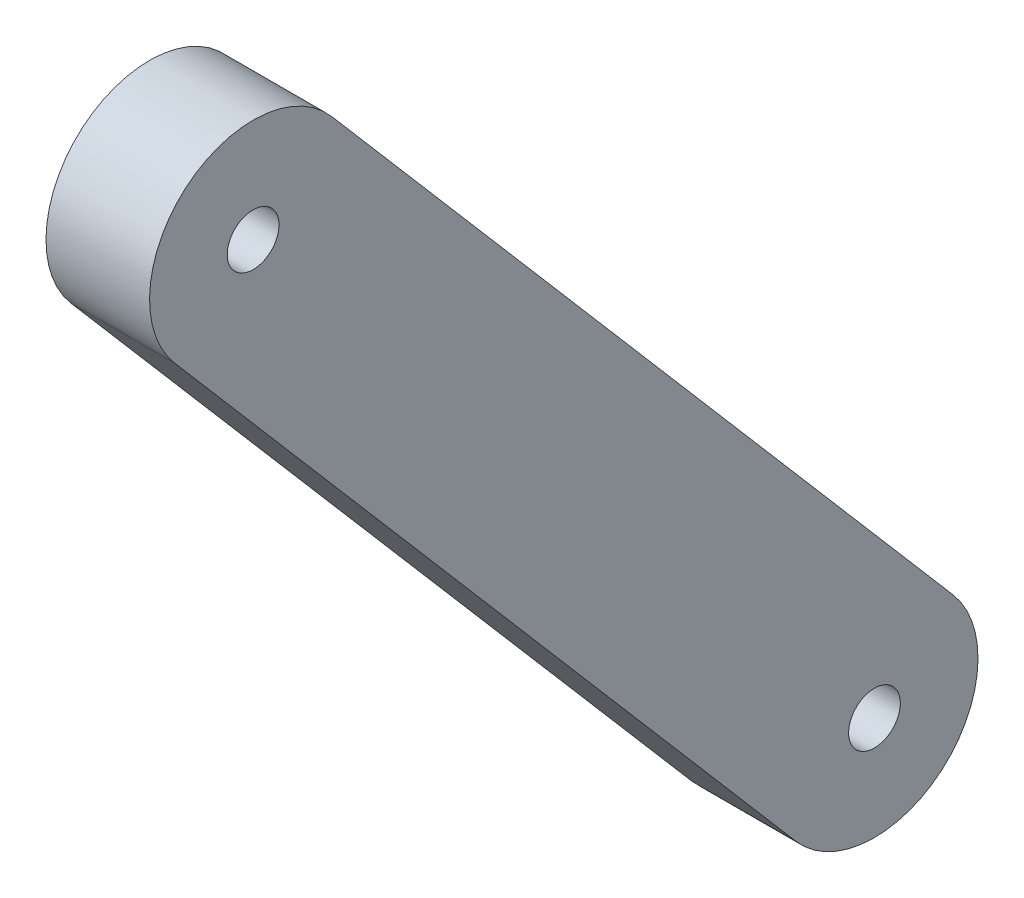
ISO-10303-21;
HEADER;
FILE_DESCRIPTION(('STEP AP214'),'2;1');
FILE_NAME('part.step','',(''),(''),'','','');
FILE_SCHEMA(('AUTOMOTIVE_DESIGN { 1 0 10303 214 1 1 1 1 }'));
ENDSEC;
DATA;
#1=APPLICATION_CONTEXT('core data for automotive mechanical design processes');
#2=APPLICATION_PROTOCOL_DEFINITION('international standard','automotive_design',2000,#1);
#3=PRODUCT_CONTEXT('',#1,'mechanical');
#4=PRODUCT('Part','Part','',(#3));
#5=PRODUCT_RELATED_PRODUCT_CATEGORY('part','',(#4));
#6=PRODUCT_DEFINITION_FORMATION('','',#4);
#7=PRODUCT_DEFINITION_CONTEXT('part definition',#1,'design');
#8=PRODUCT_DEFINITION('design','',#6,#7);
#9=PRODUCT_DEFINITION_SHAPE('','',#8);
#10=(LENGTH_UNIT() NAMED_UNIT(*) SI_UNIT(.MILLI.,.METRE.));
#11=(NAMED_UNIT(*) PLANE_ANGLE_UNIT() SI_UNIT($,.RADIAN.));
#12=(NAMED_UNIT(*) SI_UNIT($,.STERADIAN.) SOLID_ANGLE_UNIT());
#13=UNCERTAINTY_MEASURE_WITH_UNIT(LENGTH_MEASURE(1.E-05),#10,'distance_accuracy_value','');
#14=(GEOMETRIC_REPRESENTATION_CONTEXT(3) GLOBAL_UNCERTAINTY_ASSIGNED_CONTEXT((#13)) GLOBAL_UNIT_ASSIGNED_CONTEXT((#10,
#11,#12)) REPRESENTATION_CONTEXT('',''));
#15=CARTESIAN_POINT('',(0.,0.,0.));
#16=DIRECTION('',(0.,0.,1.));
#17=DIRECTION('',(1.,0.,0.));
#18=AXIS2_PLACEMENT_3D('',#15,#16,#17);
#19=CARTESIAN_POINT('',(50.,0.,0.));
#20=DIRECTION('',(1.,0.,0.));
#21=DIRECTION('',(0.,0.,-1.));
#22=AXIS2_PLACEMENT_3D('',#19,#20,#21);
#23=PLANE('',#22);
#24=CARTESIAN_POINT('',(50.,350.,300.));
#25=DIRECTION('',(1.,0.,0.));
#26=DIRECTION('',(0.,0.,-1.));
#27=AXIS2_PLACEMENT_3D('',#24,#25,#26);
#28=CIRCLE('',#27,12.5);
#29=CARTESIAN_POINT('',(50.,350.,287.5));
#30=VERTEX_POINT('',#29);
#31=EDGE_CURVE('E102',#30,#30,#28,.T.);
#32=ORIENTED_EDGE('',*,*,#31,.F.);
#33=EDGE_LOOP('',(#32));
#34=FACE_BOUND('',#33,.T.);
#35=CARTESIAN_POINT('',(50.,0.,0.));
#36=DIRECTION('',(1.,0.,0.));
#37=DIRECTION('',(0.,0.,-1.));
#38=AXIS2_PLACEMENT_3D('',#35,#36,#37);
#39=CIRCLE('',#38,50.);
#40=CARTESIAN_POINT('',(50.,-32.5395686727984,37.9628301182648));
#41=VERTEX_POINT('',#40);
#42=CARTESIAN_POINT('',(50.,32.5395686727984,-37.9628301182648));
#43=VERTEX_POINT('',#42);
#44=EDGE_CURVE('E87',#41,#43,#39,.T.);
#45=ORIENTED_EDGE('',*,*,#44,.T.);
#46=DIRECTION('',(0.,0.759256602365297,0.650791373455969));
#47=VECTOR('',#46,1.);
#48=CARTESIAN_POINT('',(50.,32.5395686727984,-37.9628301182648));
#49=LINE('',#48,#47);
#50=CARTESIAN_POINT('',(50.,382.539568672798,262.037169881735));
#51=VERTEX_POINT('',#50);
#52=EDGE_CURVE('E82',#43,#51,#49,.T.);
#53=ORIENTED_EDGE('',*,*,#52,.T.);
#54=CARTESIAN_POINT('',(50.,350.,300.));
#55=DIRECTION('',(1.,0.,0.));
#56=DIRECTION('',(0.,0.,-1.));
#57=AXIS2_PLACEMENT_3D('',#54,#55,#56);
#58=CIRCLE('',#57,50.);
#59=CARTESIAN_POINT('',(50.,317.460431327202,337.962830118265));
#60=VERTEX_POINT('',#59);
#61=EDGE_CURVE('E85',#51,#60,#58,.T.);
#62=ORIENTED_EDGE('',*,*,#61,.T.);
#63=DIRECTION('',(0.,-0.759256602365297,-0.650791373455969));
#64=VECTOR('',#63,1.);
#65=CARTESIAN_POINT('',(50.,-32.5395686727984,37.9628301182648));
#66=LINE('',#65,#64);
#67=EDGE_CURVE('E52',#60,#41,#66,.T.);
#68=ORIENTED_EDGE('',*,*,#67,.T.);
#69=EDGE_LOOP('',(#45,#53,#62,#68));
#70=FACE_BOUND('',#69,.T.);
#71=CARTESIAN_POINT('',(50.,0.,0.));
#72=DIRECTION('',(1.,0.,0.));
#73=DIRECTION('',(0.,0.,-1.));
#74=AXIS2_PLACEMENT_3D('',#71,#72,#73);
#75=CIRCLE('',#74,12.5);
#76=CARTESIAN_POINT('',(50.,0.,-12.5));
#77=VERTEX_POINT('',#76);
#78=EDGE_CURVE('E117',#77,#77,#75,.T.);
#79=ORIENTED_EDGE('',*,*,#78,.F.);
#80=EDGE_LOOP('',(#79));
#81=FACE_BOUND('',#80,.T.);
#82=ADVANCED_FACE('F35',(#34,#70,#81),#23,.T.);
#83=CARTESIAN_POINT('',(0.,0.,0.));
#84=DIRECTION('',(1.,0.,0.));
#85=DIRECTION('',(0.,0.,-1.));
#86=AXIS2_PLACEMENT_3D('',#83,#84,#85);
#87=PLANE('',#86);
#88=CARTESIAN_POINT('',(0.,350.,300.));
#89=DIRECTION('',(1.,0.,0.));
#90=DIRECTION('',(0.,0.,-1.));
#91=AXIS2_PLACEMENT_3D('',#88,#89,#90);
#92=CIRCLE('',#91,12.5);
#93=CARTESIAN_POINT('',(0.,350.,287.5));
#94=VERTEX_POINT('',#93);
#95=EDGE_CURVE('E114',#94,#94,#92,.T.);
#96=ORIENTED_EDGE('',*,*,#95,.T.);
#97=EDGE_LOOP('',(#96));
#98=FACE_BOUND('',#97,.T.);
#99=CARTESIAN_POINT('',(0.,0.,0.));
#100=DIRECTION('',(1.,0.,0.));
#101=DIRECTION('',(0.,0.,-1.));
#102=AXIS2_PLACEMENT_3D('',#99,#100,#101);
#103=CIRCLE('',#102,50.);
#104=CARTESIAN_POINT('',(0.,-32.5395686727984,37.9628301182648));
#105=VERTEX_POINT('',#104);
#106=CARTESIAN_POINT('',(0.,32.5395686727984,-37.9628301182648));
#107=VERTEX_POINT('',#106);
#108=EDGE_CURVE('E99',#105,#107,#103,.T.);
#109=ORIENTED_EDGE('',*,*,#108,.F.);
#110=DIRECTION('',(0.,-0.759256602365297,-0.650791373455969));
#111=VECTOR('',#110,1.);
#112=CARTESIAN_POINT('',(0.,-32.5395686727984,37.9628301182648));
#113=LINE('',#112,#111);
#114=CARTESIAN_POINT('',(0.,317.460431327202,337.962830118265));
#115=VERTEX_POINT('',#114);
#116=EDGE_CURVE('E75',#115,#105,#113,.T.);
#117=ORIENTED_EDGE('',*,*,#116,.F.);
#118=CARTESIAN_POINT('',(0.,350.,300.));
#119=DIRECTION('',(1.,0.,0.));
#120=DIRECTION('',(0.,0.,-1.));
#121=AXIS2_PLACEMENT_3D('',#118,#119,#120);
#122=CIRCLE('',#121,50.);
#123=CARTESIAN_POINT('',(0.,382.539568672798,262.037169881735));
#124=VERTEX_POINT('',#123);
#125=EDGE_CURVE('E69',#124,#115,#122,.T.);
#126=ORIENTED_EDGE('',*,*,#125,.F.);
#127=DIRECTION('',(0.,0.759256602365297,0.650791373455969));
#128=VECTOR('',#127,1.);
#129=CARTESIAN_POINT('',(0.,32.5395686727984,-37.9628301182648));
#130=LINE('',#129,#128);
#131=EDGE_CURVE('E91',#107,#124,#130,.T.);
#132=ORIENTED_EDGE('',*,*,#131,.F.);
#133=EDGE_LOOP('',(#109,#117,#126,#132));
#134=FACE_BOUND('',#133,.T.);
#135=CARTESIAN_POINT('',(0.,0.,0.));
#136=DIRECTION('',(1.,0.,0.));
#137=DIRECTION('',(0.,0.,-1.));
#138=AXIS2_PLACEMENT_3D('',#135,#136,#137);
#139=CIRCLE('',#138,12.5);
#140=CARTESIAN_POINT('',(0.,0.,-12.5));
#141=VERTEX_POINT('',#140);
#142=EDGE_CURVE('E120',#141,#141,#139,.T.);
#143=ORIENTED_EDGE('',*,*,#142,.T.);
#144=EDGE_LOOP('',(#143));
#145=FACE_BOUND('',#144,.T.);
#146=ADVANCED_FACE('F110',(#98,#134,#145),#87,.F.);
#147=CARTESIAN_POINT('',(50.,0.,0.));
#148=DIRECTION('',(-1.,0.,0.));
#149=DIRECTION('',(0.,0.,1.));
#150=AXIS2_PLACEMENT_3D('',#147,#148,#149);
#151=CYLINDRICAL_SURFACE('',#150,50.);
#152=ORIENTED_EDGE('',*,*,#108,.T.);
#153=DIRECTION('',(-1.,0.,0.));
#154=VECTOR('',#153,1.);
#155=CARTESIAN_POINT('',(50.,32.5395686727984,-37.9628301182648));
#156=LINE('',#155,#154);
#157=EDGE_CURVE('E11',#43,#107,#156,.T.);
#158=ORIENTED_EDGE('',*,*,#157,.F.);
#159=ORIENTED_EDGE('',*,*,#44,.F.);
#160=DIRECTION('',(-1.,0.,0.));
#161=VECTOR('',#160,1.);
#162=CARTESIAN_POINT('',(50.,-32.5395686727984,37.9628301182648));
#163=LINE('',#162,#161);
#164=EDGE_CURVE('E95',#41,#105,#163,.T.);
#165=ORIENTED_EDGE('',*,*,#164,.T.);
#166=EDGE_LOOP('',(#152,#158,#159,#165));
#167=FACE_BOUND('',#166,.T.);
#168=ADVANCED_FACE('F37',(#167),#151,.T.);
#169=CARTESIAN_POINT('',(50.,32.5395686727984,-37.9628301182648));
#170=DIRECTION('',(0.,-0.650791373455969,0.759256602365297));
#171=DIRECTION('',(0.,-0.759256602365296,-0.650791373455969));
#172=AXIS2_PLACEMENT_3D('',#169,#170,#171);
#173=PLANE('',#172);
#174=ORIENTED_EDGE('',*,*,#131,.T.);
#175=DIRECTION('',(-1.,0.,0.));
#176=VECTOR('',#175,1.);
#177=CARTESIAN_POINT('',(50.,382.539568672798,262.037169881735));
#178=LINE('',#177,#176);
#179=EDGE_CURVE('E44',#51,#124,#178,.T.);
#180=ORIENTED_EDGE('',*,*,#179,.F.);
#181=ORIENTED_EDGE('',*,*,#52,.F.);
#182=ORIENTED_EDGE('',*,*,#157,.T.);
#183=EDGE_LOOP('',(#174,#180,#181,#182));
#184=FACE_BOUND('',#183,.T.);
#185=ADVANCED_FACE('F90',(#184),#173,.F.);
#186=CARTESIAN_POINT('',(50.,350.,300.));
#187=DIRECTION('',(-1.,0.,0.));
#188=DIRECTION('',(0.,0.,1.));
#189=AXIS2_PLACEMENT_3D('',#186,#187,#188);
#190=CYLINDRICAL_SURFACE('',#189,50.);
#191=ORIENTED_EDGE('',*,*,#125,.T.);
#192=DIRECTION('',(-1.,0.,0.));
#193=VECTOR('',#192,1.);
#194=CARTESIAN_POINT('',(50.,317.460431327202,337.962830118265));
#195=LINE('',#194,#193);
#196=EDGE_CURVE('E92',#60,#115,#195,.T.);
#197=ORIENTED_EDGE('',*,*,#196,.F.);
#198=ORIENTED_EDGE('',*,*,#61,.F.);
#199=ORIENTED_EDGE('',*,*,#179,.T.);
#200=EDGE_LOOP('',(#191,#197,#198,#199));
#201=FACE_BOUND('',#200,.T.);
#202=ADVANCED_FACE('F93',(#201),#190,.T.);
#203=CARTESIAN_POINT('',(50.,-32.5395686727984,37.9628301182648));
#204=DIRECTION('',(0.,0.650791373455969,-0.759256602365297));
#205=DIRECTION('',(0.,0.759256602365296,0.650791373455969));
#206=AXIS2_PLACEMENT_3D('',#203,#204,#205);
#207=PLANE('',#206);
#208=ORIENTED_EDGE('',*,*,#116,.T.);
#209=ORIENTED_EDGE('',*,*,#164,.F.);
#210=ORIENTED_EDGE('',*,*,#67,.F.);
#211=ORIENTED_EDGE('',*,*,#196,.T.);
#212=EDGE_LOOP('',(#208,#209,#210,#211));
#213=FACE_BOUND('',#212,.T.);
#214=ADVANCED_FACE('F107',(#213),#207,.F.);
#215=CARTESIAN_POINT('',(50.,350.,300.));
#216=DIRECTION('',(-1.,0.,0.));
#217=DIRECTION('',(0.,0.,1.));
#218=AXIS2_PLACEMENT_3D('',#215,#216,#217);
#219=CYLINDRICAL_SURFACE('',#218,12.5);
#220=ORIENTED_EDGE('',*,*,#31,.T.);
#221=EDGE_LOOP('',(#220));
#222=FACE_BOUND('',#221,.T.);
#223=ORIENTED_EDGE('',*,*,#95,.F.);
#224=EDGE_LOOP('',(#223));
#225=FACE_BOUND('',#224,.T.);
#226=ADVANCED_FACE('F138',(#222,#225),#219,.F.);
#227=CARTESIAN_POINT('',(50.,0.,0.));
#228=DIRECTION('',(-1.,0.,0.));
#229=DIRECTION('',(0.,0.,1.));
#230=AXIS2_PLACEMENT_3D('',#227,#228,#229);
#231=CYLINDRICAL_SURFACE('',#230,12.5);
#232=ORIENTED_EDGE('',*,*,#78,.T.);
#233=EDGE_LOOP('',(#232));
#234=FACE_BOUND('',#233,.T.);
#235=ORIENTED_EDGE('',*,*,#142,.F.);
#236=EDGE_LOOP('',(#235));
#237=FACE_BOUND('',#236,.T.);
#238=ADVANCED_FACE('F126',(#234,#237),#231,.F.);
#239=CLOSED_SHELL('',(#82,#146,#168,#185,#202,#214,#226,#238));
#240=MANIFOLD_SOLID_BREP('B2',#239);
#241=ADVANCED_BREP_SHAPE_REPRESENTATION('',(#18,#240),#14);
#242=SHAPE_DEFINITION_REPRESENTATION(#9,#241);
ENDSEC;
END-ISO-10303-21;
